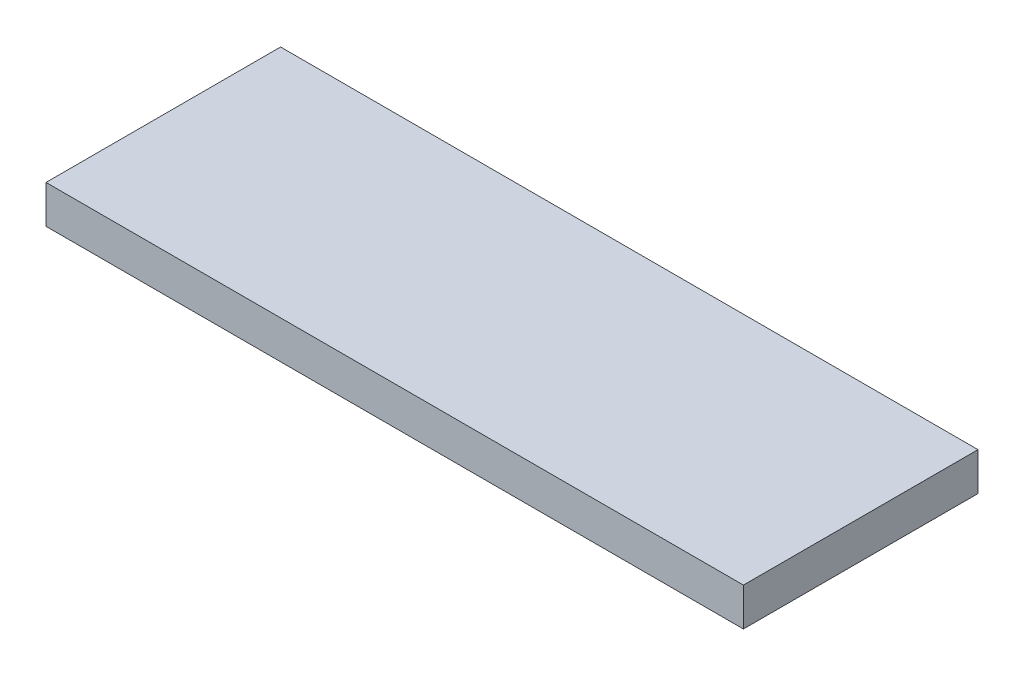
ISO-10303-21;
HEADER;
FILE_DESCRIPTION(('STEP AP214'),'2;1');
FILE_NAME('part.step','',(''),(''),'','','');
FILE_SCHEMA(('AUTOMOTIVE_DESIGN { 1 0 10303 214 1 1 1 1 }'));
ENDSEC;
DATA;
#1=APPLICATION_CONTEXT('core data for automotive mechanical design processes');
#2=APPLICATION_PROTOCOL_DEFINITION('international standard','automotive_design',2000,#1);
#3=PRODUCT_CONTEXT('',#1,'mechanical');
#4=PRODUCT('Part','Part','',(#3));
#5=PRODUCT_RELATED_PRODUCT_CATEGORY('part','',(#4));
#6=PRODUCT_DEFINITION_FORMATION('','',#4);
#7=PRODUCT_DEFINITION_CONTEXT('part definition',#1,'design');
#8=PRODUCT_DEFINITION('design','',#6,#7);
#9=PRODUCT_DEFINITION_SHAPE('','',#8);
#10=(LENGTH_UNIT() NAMED_UNIT(*) SI_UNIT(.MILLI.,.METRE.));
#11=(NAMED_UNIT(*) PLANE_ANGLE_UNIT() SI_UNIT($,.RADIAN.));
#12=(NAMED_UNIT(*) SI_UNIT($,.STERADIAN.) SOLID_ANGLE_UNIT());
#13=UNCERTAINTY_MEASURE_WITH_UNIT(LENGTH_MEASURE(1.E-05),#10,'distance_accuracy_value','');
#14=(GEOMETRIC_REPRESENTATION_CONTEXT(3) GLOBAL_UNCERTAINTY_ASSIGNED_CONTEXT((#13)) GLOBAL_UNIT_ASSIGNED_CONTEXT((#10,
#11,#12)) REPRESENTATION_CONTEXT('',''));
#15=CARTESIAN_POINT('',(0.,0.,0.));
#16=DIRECTION('',(0.,0.,1.));
#17=DIRECTION('',(1.,0.,0.));
#18=AXIS2_PLACEMENT_3D('',#15,#16,#17);
#19=CARTESIAN_POINT('',(-95.7391304347826,6.,-30.1304347826087));
#20=DIRECTION('',(1.,0.,0.));
#21=DIRECTION('',(0.,0.,-1.));
#22=AXIS2_PLACEMENT_3D('',#19,#20,#21);
#23=PLANE('',#22);
#24=DIRECTION('',(0.,0.,1.));
#25=VECTOR('',#24,1.);
#26=CARTESIAN_POINT('',(-95.7391304347826,0.,-30.1304347826087));
#27=LINE('',#26,#25);
#28=CARTESIAN_POINT('',(-95.7391304347826,0.,-30.1304347826087));
#29=VERTEX_POINT('',#28);
#30=CARTESIAN_POINT('',(-95.7391304347826,0.,6.86956521739131));
#31=VERTEX_POINT('',#30);
#32=EDGE_CURVE('E96',#29,#31,#27,.T.);
#33=ORIENTED_EDGE('',*,*,#32,.T.);
#34=DIRECTION('',(0.,-1.,0.));
#35=VECTOR('',#34,1.);
#36=CARTESIAN_POINT('',(-95.7391304347826,6.,6.86956521739131));
#37=LINE('',#36,#35);
#38=CARTESIAN_POINT('',(-95.7391304347826,6.,6.86956521739131));
#39=VERTEX_POINT('',#38);
#40=EDGE_CURVE('E11',#39,#31,#37,.T.);
#41=ORIENTED_EDGE('',*,*,#40,.F.);
#42=DIRECTION('',(0.,0.,1.));
#43=VECTOR('',#42,1.);
#44=CARTESIAN_POINT('',(-95.7391304347826,6.,-30.1304347826087));
#45=LINE('',#44,#43);
#46=CARTESIAN_POINT('',(-95.7391304347826,6.,-30.1304347826087));
#47=VERTEX_POINT('',#46);
#48=EDGE_CURVE('E84',#47,#39,#45,.T.);
#49=ORIENTED_EDGE('',*,*,#48,.F.);
#50=DIRECTION('',(0.,-1.,0.));
#51=VECTOR('',#50,1.);
#52=CARTESIAN_POINT('',(-95.7391304347826,6.,-30.1304347826087));
#53=LINE('',#52,#51);
#54=EDGE_CURVE('E92',#47,#29,#53,.T.);
#55=ORIENTED_EDGE('',*,*,#54,.T.);
#56=EDGE_LOOP('',(#33,#41,#49,#55));
#57=FACE_BOUND('',#56,.T.);
#58=ADVANCED_FACE('F33',(#57),#23,.F.);
#59=CARTESIAN_POINT('',(-95.7391304347826,6.,6.86956521739131));
#60=DIRECTION('',(0.,0.,-1.));
#61=DIRECTION('',(-1.,0.,0.));
#62=AXIS2_PLACEMENT_3D('',#59,#60,#61);
#63=PLANE('',#62);
#64=DIRECTION('',(1.,0.,0.));
#65=VECTOR('',#64,1.);
#66=CARTESIAN_POINT('',(-95.7391304347826,0.,6.86956521739131));
#67=LINE('',#66,#65);
#68=CARTESIAN_POINT('',(14.2608695652174,0.,6.86956521739131));
#69=VERTEX_POINT('',#68);
#70=EDGE_CURVE('E88',#31,#69,#67,.T.);
#71=ORIENTED_EDGE('',*,*,#70,.T.);
#72=DIRECTION('',(0.,-1.,0.));
#73=VECTOR('',#72,1.);
#74=CARTESIAN_POINT('',(14.2608695652174,6.,6.86956521739131));
#75=LINE('',#74,#73);
#76=CARTESIAN_POINT('',(14.2608695652174,6.,6.86956521739131));
#77=VERTEX_POINT('',#76);
#78=EDGE_CURVE('E41',#77,#69,#75,.T.);
#79=ORIENTED_EDGE('',*,*,#78,.F.);
#80=DIRECTION('',(1.,0.,0.));
#81=VECTOR('',#80,1.);
#82=CARTESIAN_POINT('',(-95.7391304347826,6.,6.86956521739131));
#83=LINE('',#82,#81);
#84=EDGE_CURVE('E79',#39,#77,#83,.T.);
#85=ORIENTED_EDGE('',*,*,#84,.F.);
#86=ORIENTED_EDGE('',*,*,#40,.T.);
#87=EDGE_LOOP('',(#71,#79,#85,#86));
#88=FACE_BOUND('',#87,.T.);
#89=ADVANCED_FACE('F87',(#88),#63,.F.);
#90=CARTESIAN_POINT('',(14.2608695652174,6.,-30.1304347826087));
#91=DIRECTION('',(-1.,0.,0.));
#92=DIRECTION('',(0.,0.,1.));
#93=AXIS2_PLACEMENT_3D('',#90,#91,#92);
#94=PLANE('',#93);
#95=DIRECTION('',(0.,0.,-1.));
#96=VECTOR('',#95,1.);
#97=CARTESIAN_POINT('',(14.2608695652174,0.,-30.1304347826087));
#98=LINE('',#97,#96);
#99=CARTESIAN_POINT('',(14.2608695652174,0.,-30.1304347826087));
#100=VERTEX_POINT('',#99);
#101=EDGE_CURVE('E66',#69,#100,#98,.T.);
#102=ORIENTED_EDGE('',*,*,#101,.T.);
#103=DIRECTION('',(0.,-1.,0.));
#104=VECTOR('',#103,1.);
#105=CARTESIAN_POINT('',(14.2608695652174,6.,-30.1304347826087));
#106=LINE('',#105,#104);
#107=CARTESIAN_POINT('',(14.2608695652174,6.,-30.1304347826087));
#108=VERTEX_POINT('',#107);
#109=EDGE_CURVE('E89',#108,#100,#106,.T.);
#110=ORIENTED_EDGE('',*,*,#109,.F.);
#111=DIRECTION('',(0.,0.,-1.));
#112=VECTOR('',#111,1.);
#113=CARTESIAN_POINT('',(14.2608695652174,6.,-30.1304347826087));
#114=LINE('',#113,#112);
#115=EDGE_CURVE('E82',#77,#108,#114,.T.);
#116=ORIENTED_EDGE('',*,*,#115,.F.);
#117=ORIENTED_EDGE('',*,*,#78,.T.);
#118=EDGE_LOOP('',(#102,#110,#116,#117));
#119=FACE_BOUND('',#118,.T.);
#120=ADVANCED_FACE('F90',(#119),#94,.F.);
#121=CARTESIAN_POINT('',(-95.7391304347826,6.,-30.1304347826087));
#122=DIRECTION('',(0.,0.,1.));
#123=DIRECTION('',(1.,0.,0.));
#124=AXIS2_PLACEMENT_3D('',#121,#122,#123);
#125=PLANE('',#124);
#126=DIRECTION('',(-1.,0.,0.));
#127=VECTOR('',#126,1.);
#128=CARTESIAN_POINT('',(-95.7391304347826,0.,-30.1304347826087));
#129=LINE('',#128,#127);
#130=EDGE_CURVE('E72',#100,#29,#129,.T.);
#131=ORIENTED_EDGE('',*,*,#130,.T.);
#132=ORIENTED_EDGE('',*,*,#54,.F.);
#133=DIRECTION('',(-1.,0.,0.));
#134=VECTOR('',#133,1.);
#135=CARTESIAN_POINT('',(-95.7391304347826,6.,-30.1304347826087));
#136=LINE('',#135,#134);
#137=EDGE_CURVE('E49',#108,#47,#136,.T.);
#138=ORIENTED_EDGE('',*,*,#137,.F.);
#139=ORIENTED_EDGE('',*,*,#109,.T.);
#140=EDGE_LOOP('',(#131,#132,#138,#139));
#141=FACE_BOUND('',#140,.T.);
#142=ADVANCED_FACE('F103',(#141),#125,.F.);
#143=CARTESIAN_POINT('',(0.,6.,0.));
#144=DIRECTION('',(0.,1.,0.));
#145=DIRECTION('',(0.,0.,1.));
#146=AXIS2_PLACEMENT_3D('',#143,#144,#145);
#147=PLANE('',#146);
#148=ORIENTED_EDGE('',*,*,#48,.T.);
#149=ORIENTED_EDGE('',*,*,#84,.T.);
#150=ORIENTED_EDGE('',*,*,#115,.T.);
#151=ORIENTED_EDGE('',*,*,#137,.T.);
#152=EDGE_LOOP('',(#148,#149,#150,#151));
#153=FACE_BOUND('',#152,.T.);
#154=ADVANCED_FACE('F80',(#153),#147,.T.);
#155=CARTESIAN_POINT('',(0.,0.,0.));
#156=DIRECTION('',(0.,1.,0.));
#157=DIRECTION('',(0.,0.,1.));
#158=AXIS2_PLACEMENT_3D('',#155,#156,#157);
#159=PLANE('',#158);
#160=ORIENTED_EDGE('',*,*,#32,.F.);
#161=ORIENTED_EDGE('',*,*,#130,.F.);
#162=ORIENTED_EDGE('',*,*,#101,.F.);
#163=ORIENTED_EDGE('',*,*,#70,.F.);
#164=EDGE_LOOP('',(#160,#161,#162,#163));
#165=FACE_BOUND('',#164,.T.);
#166=ADVANCED_FACE('F106',(#165),#159,.F.);
#167=CLOSED_SHELL('',(#58,#89,#120,#142,#154,#166));
#168=MANIFOLD_SOLID_BREP('B2',#167);
#169=ADVANCED_BREP_SHAPE_REPRESENTATION('',(#18,#168),#14);
#170=SHAPE_DEFINITION_REPRESENTATION(#9,#169);
ENDSEC;
END-ISO-10303-21;
